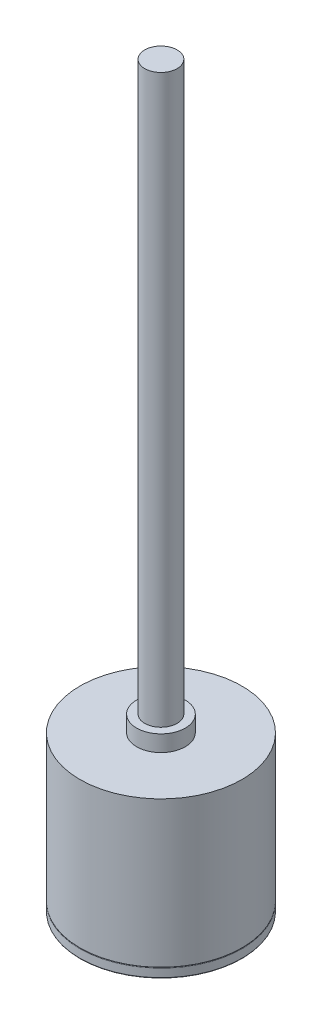
ISO-10303-21;
HEADER;
FILE_DESCRIPTION(('STEP AP214'),'2;1');
FILE_NAME('part.step','',(''),(''),'','','');
FILE_SCHEMA(('AUTOMOTIVE_DESIGN { 1 0 10303 214 1 1 1 1 }'));
ENDSEC;
DATA;
#1=APPLICATION_CONTEXT('core data for automotive mechanical design processes');
#2=APPLICATION_PROTOCOL_DEFINITION('international standard','automotive_design',2000,#1);
#3=PRODUCT_CONTEXT('',#1,'mechanical');
#4=PRODUCT('Part','Part','',(#3));
#5=PRODUCT_RELATED_PRODUCT_CATEGORY('part','',(#4));
#6=PRODUCT_DEFINITION_FORMATION('','',#4);
#7=PRODUCT_DEFINITION_CONTEXT('part definition',#1,'design');
#8=PRODUCT_DEFINITION('design','',#6,#7);
#9=PRODUCT_DEFINITION_SHAPE('','',#8);
#10=(LENGTH_UNIT() NAMED_UNIT(*) SI_UNIT(.MILLI.,.METRE.));
#11=(NAMED_UNIT(*) PLANE_ANGLE_UNIT() SI_UNIT($,.RADIAN.));
#12=(NAMED_UNIT(*) SI_UNIT($,.STERADIAN.) SOLID_ANGLE_UNIT());
#13=UNCERTAINTY_MEASURE_WITH_UNIT(LENGTH_MEASURE(1.E-05),#10,'distance_accuracy_value','');
#14=(GEOMETRIC_REPRESENTATION_CONTEXT(3) GLOBAL_UNCERTAINTY_ASSIGNED_CONTEXT((#13)) GLOBAL_UNIT_ASSIGNED_CONTEXT((#10,
#11,#12)) REPRESENTATION_CONTEXT('',''));
#15=CARTESIAN_POINT('',(0.,0.,0.));
#16=DIRECTION('',(0.,0.,1.));
#17=DIRECTION('',(1.,0.,0.));
#18=AXIS2_PLACEMENT_3D('',#15,#16,#17);
#19=CARTESIAN_POINT('',(0.,0.6,0.));
#20=DIRECTION('',(0.,-1.,0.));
#21=DIRECTION('',(0.,0.,-1.));
#22=AXIS2_PLACEMENT_3D('',#19,#20,#21);
#23=CYLINDRICAL_SURFACE('',#22,5.);
#24=CARTESIAN_POINT('',(0.,0.05,0.));
#25=DIRECTION('',(0.,1.,0.));
#26=DIRECTION('',(0.,0.,1.));
#27=AXIS2_PLACEMENT_3D('',#24,#25,#26);
#28=CIRCLE('',#27,5.);
#29=CARTESIAN_POINT('',(0.,0.05,5.));
#30=VERTEX_POINT('',#29);
#31=EDGE_CURVE('E63',#30,#30,#28,.T.);
#32=ORIENTED_EDGE('',*,*,#31,.T.);
#33=EDGE_LOOP('',(#32));
#34=FACE_BOUND('',#33,.T.);
#35=CARTESIAN_POINT('',(0.,0.55,0.));
#36=DIRECTION('',(0.,1.,0.));
#37=DIRECTION('',(0.,0.,1.));
#38=AXIS2_PLACEMENT_3D('',#35,#36,#37);
#39=CIRCLE('',#38,5.);
#40=CARTESIAN_POINT('',(0.,0.55,5.));
#41=VERTEX_POINT('',#40);
#42=EDGE_CURVE('E61',#41,#41,#39,.F.);
#43=ORIENTED_EDGE('',*,*,#42,.T.);
#44=EDGE_LOOP('',(#43));
#45=FACE_BOUND('',#44,.T.);
#46=ADVANCED_FACE('F32',(#34,#45),#23,.T.);
#47=CARTESIAN_POINT('',(0.,0.,0.));
#48=DIRECTION('',(0.,1.,0.));
#49=DIRECTION('',(0.,0.,1.));
#50=AXIS2_PLACEMENT_3D('',#47,#48,#49);
#51=PLANE('',#50);
#52=CARTESIAN_POINT('',(0.,0.,0.));
#53=DIRECTION('',(0.,1.,0.));
#54=DIRECTION('',(0.,0.,1.));
#55=AXIS2_PLACEMENT_3D('',#52,#53,#54);
#56=CIRCLE('',#55,4.95);
#57=CARTESIAN_POINT('',(0.,0.,4.95));
#58=VERTEX_POINT('',#57);
#59=EDGE_CURVE('E36',#58,#58,#56,.F.);
#60=ORIENTED_EDGE('',*,*,#59,.T.);
#61=EDGE_LOOP('',(#60));
#62=FACE_BOUND('',#61,.T.);
#63=ADVANCED_FACE('F70',(#62),#51,.F.);
#64=CARTESIAN_POINT('',(0.,0.55,0.));
#65=DIRECTION('',(0.,1.,0.));
#66=DIRECTION('',(0.,0.,1.));
#67=AXIS2_PLACEMENT_3D('',#64,#65,#66);
#68=TOROIDAL_SURFACE('',#67,4.95,0.05);
#69=ORIENTED_EDGE('',*,*,#42,.F.);
#70=EDGE_LOOP('',(#69));
#71=FACE_BOUND('',#70,.T.);
#72=CARTESIAN_POINT('',(0.,0.6,0.));
#73=DIRECTION('',(0.,1.,0.));
#74=DIRECTION('',(0.,0.,1.));
#75=AXIS2_PLACEMENT_3D('',#72,#73,#74);
#76=CIRCLE('',#75,4.95);
#77=CARTESIAN_POINT('',(0.,0.6,4.95));
#78=VERTEX_POINT('',#77);
#79=EDGE_CURVE('E56',#78,#78,#76,.T.);
#80=ORIENTED_EDGE('',*,*,#79,.F.);
#81=EDGE_LOOP('',(#80));
#82=FACE_BOUND('',#81,.T.);
#83=ADVANCED_FACE('F75',(#71,#82),#68,.T.);
#84=CARTESIAN_POINT('',(0.,0.05,0.));
#85=DIRECTION('',(0.,1.,0.));
#86=DIRECTION('',(0.,0.,1.));
#87=AXIS2_PLACEMENT_3D('',#84,#85,#86);
#88=TOROIDAL_SURFACE('',#87,4.95,0.05);
#89=ORIENTED_EDGE('',*,*,#59,.F.);
#90=EDGE_LOOP('',(#89));
#91=FACE_BOUND('',#90,.T.);
#92=ORIENTED_EDGE('',*,*,#31,.F.);
#93=EDGE_LOOP('',(#92));
#94=FACE_BOUND('',#93,.T.);
#95=ADVANCED_FACE('F34',(#91,#94),#88,.T.);
#96=CARTESIAN_POINT('',(0.,9.6,0.));
#97=DIRECTION('',(0.,-1.,0.));
#98=DIRECTION('',(0.,0.,-1.));
#99=AXIS2_PLACEMENT_3D('',#96,#97,#98);
#100=CYLINDRICAL_SURFACE('',#99,5.);
#101=CARTESIAN_POINT('',(0.,9.6,0.));
#102=DIRECTION('',(0.,1.,0.));
#103=DIRECTION('',(0.,0.,1.));
#104=AXIS2_PLACEMENT_3D('',#101,#102,#103);
#105=CIRCLE('',#104,5.);
#106=CARTESIAN_POINT('',(0.,9.6,5.));
#107=VERTEX_POINT('',#106);
#108=EDGE_CURVE('E53',#107,#107,#105,.T.);
#109=ORIENTED_EDGE('',*,*,#108,.F.);
#110=EDGE_LOOP('',(#109));
#111=FACE_BOUND('',#110,.T.);
#112=CARTESIAN_POINT('',(0.,0.6,0.));
#113=DIRECTION('',(0.,1.,0.));
#114=DIRECTION('',(0.,0.,1.));
#115=AXIS2_PLACEMENT_3D('',#112,#113,#114);
#116=CIRCLE('',#115,5.);
#117=CARTESIAN_POINT('',(0.,0.6,5.));
#118=VERTEX_POINT('',#117);
#119=EDGE_CURVE('E51',#118,#118,#116,.T.);
#120=ORIENTED_EDGE('',*,*,#119,.T.);
#121=EDGE_LOOP('',(#120));
#122=FACE_BOUND('',#121,.T.);
#123=ADVANCED_FACE('F74',(#111,#122),#100,.T.);
#124=CARTESIAN_POINT('',(0.,9.6,0.));
#125=DIRECTION('',(0.,1.,0.));
#126=DIRECTION('',(0.,0.,1.));
#127=AXIS2_PLACEMENT_3D('',#124,#125,#126);
#128=PLANE('',#127);
#129=CARTESIAN_POINT('',(0.,9.6,0.));
#130=DIRECTION('',(0.,1.,0.));
#131=DIRECTION('',(0.,0.,1.));
#132=AXIS2_PLACEMENT_3D('',#129,#130,#131);
#133=CIRCLE('',#132,1.5);
#134=CARTESIAN_POINT('',(0.,9.6,1.5));
#135=VERTEX_POINT('',#134);
#136=EDGE_CURVE('E40',#135,#135,#133,.T.);
#137=ORIENTED_EDGE('',*,*,#136,.F.);
#138=EDGE_LOOP('',(#137));
#139=FACE_BOUND('',#138,.T.);
#140=ORIENTED_EDGE('',*,*,#108,.T.);
#141=EDGE_LOOP('',(#140));
#142=FACE_BOUND('',#141,.T.);
#143=ADVANCED_FACE('F80',(#139,#142),#128,.T.);
#144=CARTESIAN_POINT('',(0.,0.6,0.));
#145=DIRECTION('',(0.,1.,0.));
#146=DIRECTION('',(0.,0.,1.));
#147=AXIS2_PLACEMENT_3D('',#144,#145,#146);
#148=PLANE('',#147);
#149=ORIENTED_EDGE('',*,*,#79,.T.);
#150=EDGE_LOOP('',(#149));
#151=FACE_BOUND('',#150,.T.);
#152=ORIENTED_EDGE('',*,*,#119,.F.);
#153=EDGE_LOOP('',(#152));
#154=FACE_BOUND('',#153,.T.);
#155=ADVANCED_FACE('F92',(#151,#154),#148,.F.);
#156=CARTESIAN_POINT('',(0.,10.6,0.));
#157=DIRECTION('',(0.,-1.,0.));
#158=DIRECTION('',(0.,0.,-1.));
#159=AXIS2_PLACEMENT_3D('',#156,#157,#158);
#160=CYLINDRICAL_SURFACE('',#159,1.5);
#161=CARTESIAN_POINT('',(0.,10.6,0.));
#162=DIRECTION('',(0.,1.,0.));
#163=DIRECTION('',(0.,0.,1.));
#164=AXIS2_PLACEMENT_3D('',#161,#162,#163);
#165=CIRCLE('',#164,1.5);
#166=CARTESIAN_POINT('',(0.,10.6,1.5));
#167=VERTEX_POINT('',#166);
#168=EDGE_CURVE('E49',#167,#167,#165,.T.);
#169=ORIENTED_EDGE('',*,*,#168,.F.);
#170=EDGE_LOOP('',(#169));
#171=FACE_BOUND('',#170,.T.);
#172=ORIENTED_EDGE('',*,*,#136,.T.);
#173=EDGE_LOOP('',(#172));
#174=FACE_BOUND('',#173,.T.);
#175=ADVANCED_FACE('F95',(#171,#174),#160,.T.);
#176=CARTESIAN_POINT('',(0.,10.6,0.));
#177=DIRECTION('',(0.,1.,0.));
#178=DIRECTION('',(0.,0.,1.));
#179=AXIS2_PLACEMENT_3D('',#176,#177,#178);
#180=PLANE('',#179);
#181=CARTESIAN_POINT('',(0.,10.6,0.));
#182=DIRECTION('',(0.,1.,0.));
#183=DIRECTION('',(0.,0.,1.));
#184=AXIS2_PLACEMENT_3D('',#181,#182,#183);
#185=CIRCLE('',#184,1.);
#186=CARTESIAN_POINT('',(0.,10.6,1.));
#187=VERTEX_POINT('',#186);
#188=EDGE_CURVE('E10',#187,#187,#185,.T.);
#189=ORIENTED_EDGE('',*,*,#188,.F.);
#190=EDGE_LOOP('',(#189));
#191=FACE_BOUND('',#190,.T.);
#192=ORIENTED_EDGE('',*,*,#168,.T.);
#193=EDGE_LOOP('',(#192));
#194=FACE_BOUND('',#193,.T.);
#195=ADVANCED_FACE('F102',(#191,#194),#180,.T.);
#196=CARTESIAN_POINT('',(0.,45.6,0.));
#197=DIRECTION('',(0.,-1.,0.));
#198=DIRECTION('',(0.,0.,-1.));
#199=AXIS2_PLACEMENT_3D('',#196,#197,#198);
#200=CYLINDRICAL_SURFACE('',#199,1.);
#201=CARTESIAN_POINT('',(0.,45.6,0.));
#202=DIRECTION('',(0.,1.,0.));
#203=DIRECTION('',(0.,0.,1.));
#204=AXIS2_PLACEMENT_3D('',#201,#202,#203);
#205=CIRCLE('',#204,1.);
#206=CARTESIAN_POINT('',(0.,45.6,1.));
#207=VERTEX_POINT('',#206);
#208=EDGE_CURVE('E48',#207,#207,#205,.T.);
#209=ORIENTED_EDGE('',*,*,#208,.F.);
#210=EDGE_LOOP('',(#209));
#211=FACE_BOUND('',#210,.T.);
#212=ORIENTED_EDGE('',*,*,#188,.T.);
#213=EDGE_LOOP('',(#212));
#214=FACE_BOUND('',#213,.T.);
#215=ADVANCED_FACE('F106',(#211,#214),#200,.T.);
#216=CARTESIAN_POINT('',(0.,45.6,0.));
#217=DIRECTION('',(0.,1.,0.));
#218=DIRECTION('',(0.,0.,1.));
#219=AXIS2_PLACEMENT_3D('',#216,#217,#218);
#220=PLANE('',#219);
#221=ORIENTED_EDGE('',*,*,#208,.T.);
#222=EDGE_LOOP('',(#221));
#223=FACE_BOUND('',#222,.T.);
#224=ADVANCED_FACE('F110',(#223),#220,.T.);
#225=CLOSED_SHELL('',(#46,#63,#83,#95,#123,#143,#155,#175,#195,#215,#224));
#226=MANIFOLD_SOLID_BREP('B2',#225);
#227=ADVANCED_BREP_SHAPE_REPRESENTATION('',(#18,#226),#14);
#228=SHAPE_DEFINITION_REPRESENTATION(#9,#227);
ENDSEC;
END-ISO-10303-21;
